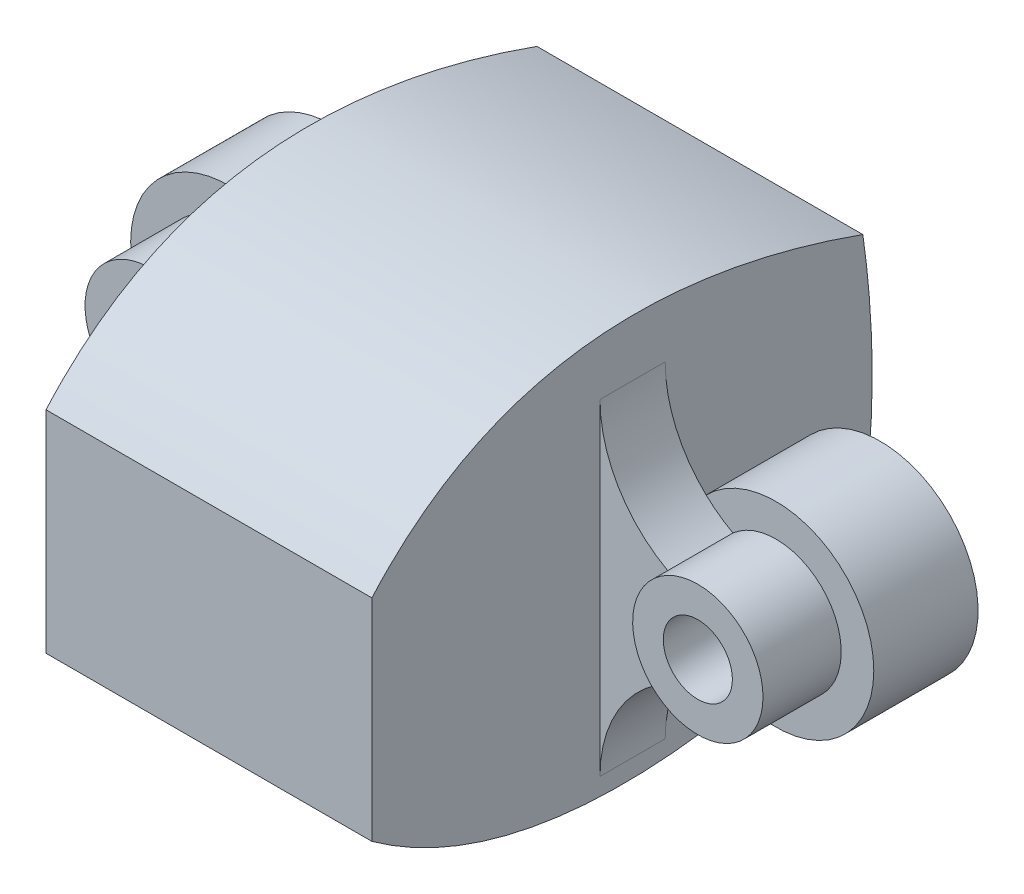
ISO-10303-21;
HEADER;
FILE_DESCRIPTION(('STEP AP214'),'2;1');
FILE_NAME('part.step','',(''),(''),'','','');
FILE_SCHEMA(('AUTOMOTIVE_DESIGN { 1 0 10303 214 1 1 1 1 }'));
ENDSEC;
DATA;
#1=APPLICATION_CONTEXT('core data for automotive mechanical design processes');
#2=APPLICATION_PROTOCOL_DEFINITION('international standard','automotive_design',2000,#1);
#3=PRODUCT_CONTEXT('',#1,'mechanical');
#4=PRODUCT('Part','Part','',(#3));
#5=PRODUCT_RELATED_PRODUCT_CATEGORY('part','',(#4));
#6=PRODUCT_DEFINITION_FORMATION('','',#4);
#7=PRODUCT_DEFINITION_CONTEXT('part definition',#1,'design');
#8=PRODUCT_DEFINITION('design','',#6,#7);
#9=PRODUCT_DEFINITION_SHAPE('','',#8);
#10=(LENGTH_UNIT() NAMED_UNIT(*) SI_UNIT(.MILLI.,.METRE.));
#11=(NAMED_UNIT(*) PLANE_ANGLE_UNIT() SI_UNIT($,.RADIAN.));
#12=(NAMED_UNIT(*) SI_UNIT($,.STERADIAN.) SOLID_ANGLE_UNIT());
#13=UNCERTAINTY_MEASURE_WITH_UNIT(LENGTH_MEASURE(1.E-05),#10,'distance_accuracy_value','');
#14=(GEOMETRIC_REPRESENTATION_CONTEXT(3) GLOBAL_UNCERTAINTY_ASSIGNED_CONTEXT((#13)) GLOBAL_UNIT_ASSIGNED_CONTEXT((#10,
#11,#12)) REPRESENTATION_CONTEXT('',''));
#15=CARTESIAN_POINT('',(0.,0.,0.));
#16=DIRECTION('',(0.,0.,1.));
#17=DIRECTION('',(1.,0.,0.));
#18=AXIS2_PLACEMENT_3D('',#15,#16,#17);
#19=CARTESIAN_POINT('',(27.5,-3.75484590396802,0.696184676668378));
#20=DIRECTION('',(0.,0.,-1.));
#21=DIRECTION('',(-1.,0.,0.));
#22=AXIS2_PLACEMENT_3D('',#19,#20,#21);
#23=PLANE('',#22);
#24=CARTESIAN_POINT('',(-21.0048094716167,-0.00484590396801488,0.696184676668378));
#25=DIRECTION('',(0.,0.,-1.));
#26=DIRECTION('',(-1.,0.,0.));
#27=AXIS2_PLACEMENT_3D('',#24,#25,#26);
#28=CIRCLE('',#27,5.);
#29=CARTESIAN_POINT('',(-17.697620332786,-3.75484590396802,0.696184676668378));
#30=VERTEX_POINT('',#29);
#31=CARTESIAN_POINT('',(-17.697620332786,3.74515409603199,0.696184676668378));
#32=VERTEX_POINT('',#31);
#33=EDGE_CURVE('E173',#30,#32,#28,.F.);
#34=ORIENTED_EDGE('',*,*,#33,.F.);
#35=CARTESIAN_POINT('',(-22.5,-12.5262283224885,0.696184676668378));
#36=DIRECTION('',(0.,0.,-1.));
#37=DIRECTION('',(-1.,0.,0.));
#38=AXIS2_PLACEMENT_3D('',#35,#36,#37);
#39=CIRCLE('',#38,10.);
#40=CARTESIAN_POINT('',(-12.5,-12.5262283224885,0.696184676668378));
#41=VERTEX_POINT('',#40);
#42=EDGE_CURVE('E50',#30,#41,#39,.T.);
#43=ORIENTED_EDGE('',*,*,#42,.T.);
#44=DIRECTION('',(0.,1.,0.));
#45=VECTOR('',#44,1.);
#46=CARTESIAN_POINT('',(-12.5,-13.9143828199088,0.696184676668378));
#47=LINE('',#46,#45);
#48=CARTESIAN_POINT('',(-12.5,12.5165365145524,0.696184676668378));
#49=VERTEX_POINT('',#48);
#50=EDGE_CURVE('E344',#41,#49,#47,.T.);
#51=ORIENTED_EDGE('',*,*,#50,.T.);
#52=CARTESIAN_POINT('',(-22.5,12.5165365145524,0.696184676668378));
#53=DIRECTION('',(0.,0.,-1.));
#54=DIRECTION('',(-1.,0.,0.));
#55=AXIS2_PLACEMENT_3D('',#52,#53,#54);
#56=CIRCLE('',#55,10.);
#57=EDGE_CURVE('E395',#49,#32,#56,.T.);
#58=ORIENTED_EDGE('',*,*,#57,.T.);
#59=EDGE_LOOP('',(#34,#43,#51,#58));
#60=FACE_BOUND('',#59,.T.);
#61=ADVANCED_FACE('F41',(#60),#23,.F.);
#62=CARTESIAN_POINT('',(21.0048094716167,-0.00484590396801488,0.696184676668378));
#63=DIRECTION('',(0.,0.,-1.));
#64=DIRECTION('',(-1.,0.,0.));
#65=AXIS2_PLACEMENT_3D('',#62,#63,#64);
#66=CIRCLE('',#65,5.);
#67=CARTESIAN_POINT('',(17.697620332786,3.74515409603199,0.696184676668378));
#68=VERTEX_POINT('',#67);
#69=CARTESIAN_POINT('',(17.697620332786,-3.75484590396802,0.696184676668378));
#70=VERTEX_POINT('',#69);
#71=EDGE_CURVE('E190',#68,#70,#66,.F.);
#72=ORIENTED_EDGE('',*,*,#71,.F.);
#73=CARTESIAN_POINT('',(22.5,12.5165365145524,0.696184676668378));
#74=DIRECTION('',(0.,0.,-1.));
#75=DIRECTION('',(-1.,0.,0.));
#76=AXIS2_PLACEMENT_3D('',#73,#74,#75);
#77=CIRCLE('',#76,10.);
#78=CARTESIAN_POINT('',(12.5,12.5165365145524,0.696184676668378));
#79=VERTEX_POINT('',#78);
#80=EDGE_CURVE('E387',#68,#79,#77,.T.);
#81=ORIENTED_EDGE('',*,*,#80,.T.);
#82=DIRECTION('',(0.,1.,0.));
#83=VECTOR('',#82,1.);
#84=CARTESIAN_POINT('',(12.5,-13.9143828199088,0.696184676668378));
#85=LINE('',#84,#83);
#86=CARTESIAN_POINT('',(12.5,-12.5262283224885,0.696184676668378));
#87=VERTEX_POINT('',#86);
#88=EDGE_CURVE('E208',#87,#79,#85,.T.);
#89=ORIENTED_EDGE('',*,*,#88,.F.);
#90=CARTESIAN_POINT('',(22.5,-12.5262283224885,0.696184676668378));
#91=DIRECTION('',(0.,0.,-1.));
#92=DIRECTION('',(-1.,0.,0.));
#93=AXIS2_PLACEMENT_3D('',#90,#91,#92);
#94=CIRCLE('',#93,10.);
#95=EDGE_CURVE('E376',#87,#70,#94,.T.);
#96=ORIENTED_EDGE('',*,*,#95,.T.);
#97=EDGE_LOOP('',(#72,#81,#89,#96));
#98=FACE_BOUND('',#97,.T.);
#99=ADVANCED_FACE('F260',(#98),#23,.F.);
#100=CARTESIAN_POINT('',(12.5,-13.9143828199088,-0.592625515878692));
#101=DIRECTION('',(1.,0.,0.));
#102=DIRECTION('',(0.,0.,-1.));
#103=AXIS2_PLACEMENT_3D('',#100,#101,#102);
#104=PLANE('',#103);
#105=CARTESIAN_POINT('',(12.5,-8.09421069616466,18.1961846766684));
#106=CARTESIAN_POINT('',(12.5,-16.4385603035779,6.64246983563475));
#107=CARTESIAN_POINT('',(12.5,-14.3857687324639,-8.25521453405886));
#108=CARTESIAN_POINT('',(12.5,-10.7478647549805,-18.0989547084256));
#109=B_SPLINE_CURVE_WITH_KNOTS('',3,(#105,#106,#107,#108),.UNSPECIFIED.,.F.,.F.,(4,4),(0.,1.),.UNSPECIFIED.);
#110=CARTESIAN_POINT('',(12.5,-8.09421069616467,18.1961846766684));
#111=VERTEX_POINT('',#110);
#112=CARTESIAN_POINT('',(12.5,-10.7478647549805,-18.0989547084256));
#113=VERTEX_POINT('',#112);
#114=EDGE_CURVE('E218',#111,#113,#109,.T.);
#115=ORIENTED_EDGE('',*,*,#114,.T.);
#116=CARTESIAN_POINT('',(12.5,-10.7478647549805,-18.0989547084256));
#117=CARTESIAN_POINT('',(12.5,-0.263434206745711,-21.4154582491938));
#118=CARTESIAN_POINT('',(12.5,13.3918270058603,-19.4685826097499));
#119=B_SPLINE_CURVE_WITH_KNOTS('',2,(#116,#117,#118),.UNSPECIFIED.,.F.,.F.,(3,3),(0.,1.),.UNSPECIFIED.);
#120=CARTESIAN_POINT('',(12.5,13.3918270058603,-19.4685826097499));
#121=VERTEX_POINT('',#120);
#122=EDGE_CURVE('E225',#113,#121,#119,.T.);
#123=ORIENTED_EDGE('',*,*,#122,.T.);
#124=CARTESIAN_POINT('',(12.5,13.3918270058603,-19.4685826097499));
#125=CARTESIAN_POINT('',(12.5,22.3791261316538,5.56746495496059));
#126=CARTESIAN_POINT('',(12.5,8.08451888822864,18.1961846766684));
#127=B_SPLINE_CURVE_WITH_KNOTS('',2,(#124,#125,#126),.UNSPECIFIED.,.F.,.F.,(3,3),(0.,1.),.UNSPECIFIED.);
#128=CARTESIAN_POINT('',(12.5,8.08451888822864,18.1961846766684));
#129=VERTEX_POINT('',#128);
#130=EDGE_CURVE('E290',#121,#129,#127,.T.);
#131=ORIENTED_EDGE('',*,*,#130,.T.);
#132=DIRECTION('',(0.,-1.,0.));
#133=VECTOR('',#132,1.);
#134=CARTESIAN_POINT('',(12.5,-8.09421069616467,18.1961846766684));
#135=LINE('',#134,#133);
#136=EDGE_CURVE('E296',#129,#111,#135,.T.);
#137=ORIENTED_EDGE('',*,*,#136,.T.);
#138=EDGE_LOOP('',(#115,#123,#131,#137));
#139=FACE_BOUND('',#138,.T.);
#140=DIRECTION('',(0.,0.,1.));
#141=VECTOR('',#140,1.);
#142=CARTESIAN_POINT('',(12.5,-12.5262283224885,0.696184676668378));
#143=LINE('',#142,#141);
#144=CARTESIAN_POINT('',(12.5,-12.5262283224885,-4.30381532333162));
#145=VERTEX_POINT('',#144);
#146=EDGE_CURVE('E356',#145,#87,#143,.T.);
#147=ORIENTED_EDGE('',*,*,#146,.T.);
#148=ORIENTED_EDGE('',*,*,#88,.T.);
#149=DIRECTION('',(0.,0.,1.));
#150=VECTOR('',#149,1.);
#151=CARTESIAN_POINT('',(12.5,12.5165365145524,-4.30381532333162));
#152=LINE('',#151,#150);
#153=CARTESIAN_POINT('',(12.5,12.5165365145524,-4.30381532333162));
#154=VERTEX_POINT('',#153);
#155=EDGE_CURVE('E352',#79,#154,#152,.F.);
#156=ORIENTED_EDGE('',*,*,#155,.T.);
#157=DIRECTION('',(0.,-1.,0.));
#158=VECTOR('',#157,1.);
#159=CARTESIAN_POINT('',(12.5,-13.9143828199088,-4.30381532333162));
#160=LINE('',#159,#158);
#161=EDGE_CURVE('E214',#154,#145,#160,.T.);
#162=ORIENTED_EDGE('',*,*,#161,.T.);
#163=EDGE_LOOP('',(#147,#148,#156,#162));
#164=FACE_BOUND('',#163,.T.);
#165=ADVANCED_FACE('F266',(#139,#164),#104,.T.);
#166=CARTESIAN_POINT('',(-12.5,-13.9143828199088,-0.592625515878692));
#167=DIRECTION('',(1.,0.,0.));
#168=DIRECTION('',(0.,0.,-1.));
#169=AXIS2_PLACEMENT_3D('',#166,#167,#168);
#170=PLANE('',#169);
#171=CARTESIAN_POINT('',(-12.5,-8.09421069616466,18.1961846766684));
#172=CARTESIAN_POINT('',(-12.5,-16.4385603035779,6.64246983563475));
#173=CARTESIAN_POINT('',(-12.5,-14.3857687324639,-8.25521453405886));
#174=CARTESIAN_POINT('',(-12.5,-10.7478647549805,-18.0989547084256));
#175=B_SPLINE_CURVE_WITH_KNOTS('',3,(#171,#172,#173,#174),.UNSPECIFIED.,.F.,.F.,(4,4),(0.,1.),.UNSPECIFIED.);
#176=CARTESIAN_POINT('',(-12.5,-8.09421069616467,18.1961846766684));
#177=VERTEX_POINT('',#176);
#178=CARTESIAN_POINT('',(-12.5,-10.7478647549805,-18.0989547084256));
#179=VERTEX_POINT('',#178);
#180=EDGE_CURVE('E217',#177,#179,#175,.T.);
#181=ORIENTED_EDGE('',*,*,#180,.F.);
#182=DIRECTION('',(0.,-1.,0.));
#183=VECTOR('',#182,1.);
#184=CARTESIAN_POINT('',(-12.5,-8.09421069616467,18.1961846766684));
#185=LINE('',#184,#183);
#186=CARTESIAN_POINT('',(-12.5,8.08451888822864,18.1961846766684));
#187=VERTEX_POINT('',#186);
#188=EDGE_CURVE('E226',#187,#177,#185,.T.);
#189=ORIENTED_EDGE('',*,*,#188,.F.);
#190=CARTESIAN_POINT('',(-12.5,13.3918270058603,-19.4685826097499));
#191=CARTESIAN_POINT('',(-12.5,22.3791261316538,5.56746495496059));
#192=CARTESIAN_POINT('',(-12.5,8.08451888822864,18.1961846766684));
#193=B_SPLINE_CURVE_WITH_KNOTS('',2,(#190,#191,#192),.UNSPECIFIED.,.F.,.F.,(3,3),(0.,1.),.UNSPECIFIED.);
#194=CARTESIAN_POINT('',(-12.5,13.3918270058603,-19.4685826097499));
#195=VERTEX_POINT('',#194);
#196=EDGE_CURVE('E316',#195,#187,#193,.T.);
#197=ORIENTED_EDGE('',*,*,#196,.F.);
#198=CARTESIAN_POINT('',(-12.5,-10.7478647549805,-18.0989547084256));
#199=CARTESIAN_POINT('',(-12.5,-0.263434206745711,-21.4154582491938));
#200=CARTESIAN_POINT('',(-12.5,13.3918270058603,-19.4685826097499));
#201=B_SPLINE_CURVE_WITH_KNOTS('',2,(#198,#199,#200),.UNSPECIFIED.,.F.,.F.,(3,3),(0.,1.),.UNSPECIFIED.);
#202=EDGE_CURVE('E308',#179,#195,#201,.T.);
#203=ORIENTED_EDGE('',*,*,#202,.F.);
#204=EDGE_LOOP('',(#181,#189,#197,#203));
#205=FACE_BOUND('',#204,.T.);
#206=DIRECTION('',(0.,-1.,0.));
#207=VECTOR('',#206,1.);
#208=CARTESIAN_POINT('',(-12.5,-13.9143828199088,-4.30381532333162));
#209=LINE('',#208,#207);
#210=CARTESIAN_POINT('',(-12.5,12.5165365145524,-4.30381532333162));
#211=VERTEX_POINT('',#210);
#212=CARTESIAN_POINT('',(-12.5,-12.5262283224885,-4.30381532333162));
#213=VERTEX_POINT('',#212);
#214=EDGE_CURVE('E347',#211,#213,#209,.T.);
#215=ORIENTED_EDGE('',*,*,#214,.F.);
#216=DIRECTION('',(0.,0.,-1.));
#217=VECTOR('',#216,1.);
#218=CARTESIAN_POINT('',(-12.5,12.5165365145524,-0.592625515878692));
#219=LINE('',#218,#217);
#220=EDGE_CURVE('E155',#211,#49,#219,.F.);
#221=ORIENTED_EDGE('',*,*,#220,.T.);
#222=ORIENTED_EDGE('',*,*,#50,.F.);
#223=DIRECTION('',(0.,0.,-1.));
#224=VECTOR('',#223,1.);
#225=CARTESIAN_POINT('',(-12.5,-12.5262283224885,-0.592625515878692));
#226=LINE('',#225,#224);
#227=EDGE_CURVE('E367',#41,#213,#226,.T.);
#228=ORIENTED_EDGE('',*,*,#227,.T.);
#229=EDGE_LOOP('',(#215,#221,#222,#228));
#230=FACE_BOUND('',#229,.T.);
#231=ADVANCED_FACE('F240',(#205,#230),#170,.F.);
#232=DIRECTION('',(-1.,0.,0.));
#233=VECTOR('',#232,1.);
#234=SURFACE_OF_LINEAR_EXTRUSION('',#109,#233);
#235=ORIENTED_EDGE('',*,*,#180,.T.);
#236=DIRECTION('',(-1.,0.,0.));
#237=VECTOR('',#236,1.);
#238=CARTESIAN_POINT('',(12.5,-10.7478647549805,-18.0989547084256));
#239=LINE('',#238,#237);
#240=EDGE_CURVE('E340',#113,#179,#239,.T.);
#241=ORIENTED_EDGE('',*,*,#240,.F.);
#242=ORIENTED_EDGE('',*,*,#114,.F.);
#243=DIRECTION('',(-1.,0.,0.));
#244=VECTOR('',#243,1.);
#245=CARTESIAN_POINT('',(12.5,-8.09421069616467,18.1961846766684));
#246=LINE('',#245,#244);
#247=EDGE_CURVE('E302',#111,#177,#246,.T.);
#248=ORIENTED_EDGE('',*,*,#247,.T.);
#249=EDGE_LOOP('',(#235,#241,#242,#248));
#250=FACE_BOUND('',#249,.T.);
#251=ADVANCED_FACE('F235',(#250),#234,.F.);
#252=DIRECTION('',(-1.,0.,0.));
#253=VECTOR('',#252,1.);
#254=SURFACE_OF_LINEAR_EXTRUSION('',#119,#253);
#255=ORIENTED_EDGE('',*,*,#202,.T.);
#256=DIRECTION('',(-1.,0.,0.));
#257=VECTOR('',#256,1.);
#258=CARTESIAN_POINT('',(12.5,13.3918270058603,-19.4685826097499));
#259=LINE('',#258,#257);
#260=EDGE_CURVE('E336',#121,#195,#259,.T.);
#261=ORIENTED_EDGE('',*,*,#260,.F.);
#262=ORIENTED_EDGE('',*,*,#122,.F.);
#263=ORIENTED_EDGE('',*,*,#240,.T.);
#264=EDGE_LOOP('',(#255,#261,#262,#263));
#265=FACE_BOUND('',#264,.T.);
#266=ADVANCED_FACE('F239',(#265),#254,.F.);
#267=DIRECTION('',(-1.,0.,0.));
#268=VECTOR('',#267,1.);
#269=SURFACE_OF_LINEAR_EXTRUSION('',#127,#268);
#270=ORIENTED_EDGE('',*,*,#196,.T.);
#271=DIRECTION('',(-1.,0.,0.));
#272=VECTOR('',#271,1.);
#273=CARTESIAN_POINT('',(12.5,8.08451888822864,18.1961846766684));
#274=LINE('',#273,#272);
#275=EDGE_CURVE('E332',#129,#187,#274,.T.);
#276=ORIENTED_EDGE('',*,*,#275,.F.);
#277=ORIENTED_EDGE('',*,*,#130,.F.);
#278=ORIENTED_EDGE('',*,*,#260,.T.);
#279=EDGE_LOOP('',(#270,#276,#277,#278));
#280=FACE_BOUND('',#279,.T.);
#281=ADVANCED_FACE('F286',(#280),#269,.F.);
#282=CARTESIAN_POINT('',(12.5,-8.09421069616467,18.1961846766684));
#283=DIRECTION('',(0.,0.,-1.));
#284=DIRECTION('',(-1.,0.,0.));
#285=AXIS2_PLACEMENT_3D('',#282,#283,#284);
#286=PLANE('',#285);
#287=ORIENTED_EDGE('',*,*,#188,.T.);
#288=ORIENTED_EDGE('',*,*,#247,.F.);
#289=ORIENTED_EDGE('',*,*,#136,.F.);
#290=ORIENTED_EDGE('',*,*,#275,.T.);
#291=EDGE_LOOP('',(#287,#288,#289,#290));
#292=FACE_BOUND('',#291,.T.);
#293=ADVANCED_FACE('F284',(#292),#286,.F.);
#294=CARTESIAN_POINT('',(27.5,-3.75484590396802,-4.30381532333162));
#295=DIRECTION('',(0.,0.,1.));
#296=DIRECTION('',(1.,0.,0.));
#297=AXIS2_PLACEMENT_3D('',#294,#295,#296);
#298=PLANE('',#297);
#299=CARTESIAN_POINT('',(-21.0048094716167,-0.00484590396801488,-4.30381532333162));
#300=DIRECTION('',(0.,0.,1.));
#301=DIRECTION('',(1.,0.,0.));
#302=AXIS2_PLACEMENT_3D('',#299,#300,#301);
#303=CIRCLE('',#302,7.5);
#304=CARTESIAN_POINT('',(-15.6421857546785,5.2384609600761,-4.30381532333162));
#305=VERTEX_POINT('',#304);
#306=CARTESIAN_POINT('',(-15.6421857546785,-5.24815276801212,-4.30381532333162));
#307=VERTEX_POINT('',#306);
#308=EDGE_CURVE('E56',#305,#307,#303,.F.);
#309=ORIENTED_EDGE('',*,*,#308,.F.);
#310=CARTESIAN_POINT('',(-22.5,12.5165365145524,-4.30381532333162));
#311=DIRECTION('',(0.,0.,1.));
#312=DIRECTION('',(1.,0.,0.));
#313=AXIS2_PLACEMENT_3D('',#310,#311,#312);
#314=CIRCLE('',#313,10.);
#315=EDGE_CURVE('E391',#305,#211,#314,.T.);
#316=ORIENTED_EDGE('',*,*,#315,.T.);
#317=ORIENTED_EDGE('',*,*,#214,.T.);
#318=CARTESIAN_POINT('',(-22.5,-12.5262283224885,-4.30381532333162));
#319=DIRECTION('',(0.,0.,1.));
#320=DIRECTION('',(1.,0.,0.));
#321=AXIS2_PLACEMENT_3D('',#318,#319,#320);
#322=CIRCLE('',#321,10.);
#323=EDGE_CURVE('E11',#213,#307,#322,.T.);
#324=ORIENTED_EDGE('',*,*,#323,.T.);
#325=EDGE_LOOP('',(#309,#316,#317,#324));
#326=FACE_BOUND('',#325,.T.);
#327=ADVANCED_FACE('F276',(#326),#298,.F.);
#328=CARTESIAN_POINT('',(21.0048094716167,-0.00484590396801488,-4.30381532333162));
#329=DIRECTION('',(0.,0.,-1.));
#330=DIRECTION('',(-1.,0.,0.));
#331=AXIS2_PLACEMENT_3D('',#328,#329,#330);
#332=CIRCLE('',#331,7.5);
#333=CARTESIAN_POINT('',(15.6421857546785,-5.24815276801213,-4.30381532333162));
#334=VERTEX_POINT('',#333);
#335=CARTESIAN_POINT('',(15.6421857546785,5.2384609600761,-4.30381532333162));
#336=VERTEX_POINT('',#335);
#337=EDGE_CURVE('E64',#334,#336,#332,.T.);
#338=ORIENTED_EDGE('',*,*,#337,.F.);
#339=CARTESIAN_POINT('',(22.5,-12.5262283224885,-4.30381532333162));
#340=DIRECTION('',(0.,0.,1.));
#341=DIRECTION('',(1.,0.,0.));
#342=AXIS2_PLACEMENT_3D('',#339,#340,#341);
#343=CIRCLE('',#342,10.);
#344=EDGE_CURVE('E379',#334,#145,#343,.T.);
#345=ORIENTED_EDGE('',*,*,#344,.T.);
#346=ORIENTED_EDGE('',*,*,#161,.F.);
#347=CARTESIAN_POINT('',(22.5,12.5165365145524,-4.30381532333162));
#348=DIRECTION('',(0.,0.,1.));
#349=DIRECTION('',(1.,0.,0.));
#350=AXIS2_PLACEMENT_3D('',#347,#348,#349);
#351=CIRCLE('',#350,10.);
#352=EDGE_CURVE('E383',#154,#336,#351,.T.);
#353=ORIENTED_EDGE('',*,*,#352,.T.);
#354=EDGE_LOOP('',(#338,#345,#346,#353));
#355=FACE_BOUND('',#354,.T.);
#356=ADVANCED_FACE('F272',(#355),#298,.F.);
#357=CARTESIAN_POINT('',(21.0048094716167,-0.00484590396801488,-4.30381532333162));
#358=DIRECTION('',(0.,0.,-1.));
#359=DIRECTION('',(-1.,0.,0.));
#360=AXIS2_PLACEMENT_3D('',#357,#358,#359);
#361=PLANE('',#360);
#362=CARTESIAN_POINT('',(21.0048094716167,-0.00484590396801488,-4.30381532333162));
#363=DIRECTION('',(0.,0.,1.));
#364=DIRECTION('',(1.,0.,0.));
#365=AXIS2_PLACEMENT_3D('',#362,#363,#364);
#366=CIRCLE('',#365,5.);
#367=CARTESIAN_POINT('',(17.697620332786,-3.75484590396802,-4.30381532333162));
#368=VERTEX_POINT('',#367);
#369=CARTESIAN_POINT('',(17.697620332786,3.74515409603199,-4.30381532333162));
#370=VERTEX_POINT('',#369);
#371=EDGE_CURVE('E172',#368,#370,#366,.T.);
#372=ORIENTED_EDGE('',*,*,#371,.F.);
#373=CARTESIAN_POINT('',(22.5,-12.5262283224885,-4.30381532333162));
#374=DIRECTION('',(0.,0.,-1.));
#375=DIRECTION('',(-1.,0.,0.));
#376=AXIS2_PLACEMENT_3D('',#373,#374,#375);
#377=CIRCLE('',#376,10.);
#378=EDGE_CURVE('E363',#368,#334,#377,.F.);
#379=ORIENTED_EDGE('',*,*,#378,.T.);
#380=EDGE_CURVE('E209',#336,#334,#332,.T.);
#381=ORIENTED_EDGE('',*,*,#380,.F.);
#382=CARTESIAN_POINT('',(22.5,12.5165365145524,-4.30381532333162));
#383=DIRECTION('',(0.,0.,-1.));
#384=DIRECTION('',(-1.,0.,0.));
#385=AXIS2_PLACEMENT_3D('',#382,#383,#384);
#386=CIRCLE('',#385,10.);
#387=EDGE_CURVE('E360',#336,#370,#386,.F.);
#388=ORIENTED_EDGE('',*,*,#387,.T.);
#389=EDGE_LOOP('',(#372,#379,#381,#388));
#390=FACE_BOUND('',#389,.T.);
#391=ADVANCED_FACE('F275',(#390),#361,.F.);
#392=CARTESIAN_POINT('',(21.0048094716167,-0.00484590396801488,-12.3038153233316));
#393=DIRECTION('',(0.,0.,1.));
#394=DIRECTION('',(1.,0.,0.));
#395=AXIS2_PLACEMENT_3D('',#392,#393,#394);
#396=CYLINDRICAL_SURFACE('',#395,7.5);
#397=CARTESIAN_POINT('',(21.0048094716167,-0.00484590396801488,-12.3038153233316));
#398=DIRECTION('',(0.,0.,-1.));
#399=DIRECTION('',(-1.,0.,0.));
#400=AXIS2_PLACEMENT_3D('',#397,#398,#399);
#401=CIRCLE('',#400,7.5);
#402=CARTESIAN_POINT('',(13.5048094716167,-0.00484590396801488,-12.3038153233316));
#403=VERTEX_POINT('',#402);
#404=EDGE_CURVE('E204',#403,#403,#401,.T.);
#405=ORIENTED_EDGE('',*,*,#404,.F.);
#406=EDGE_LOOP('',(#405));
#407=FACE_BOUND('',#406,.T.);
#408=ORIENTED_EDGE('',*,*,#337,.T.);
#409=ORIENTED_EDGE('',*,*,#380,.T.);
#410=EDGE_LOOP('',(#408,#409));
#411=FACE_BOUND('',#410,.T.);
#412=ADVANCED_FACE('F270',(#407,#411),#396,.T.);
#413=CARTESIAN_POINT('',(21.0048094716167,-0.00484590396801488,-12.3038153233316));
#414=DIRECTION('',(0.,0.,-1.));
#415=DIRECTION('',(-1.,0.,0.));
#416=AXIS2_PLACEMENT_3D('',#413,#414,#415);
#417=PLANE('',#416);
#418=ORIENTED_EDGE('',*,*,#404,.T.);
#419=EDGE_LOOP('',(#418));
#420=FACE_BOUND('',#419,.T.);
#421=ADVANCED_FACE('F454',(#420),#417,.T.);
#422=CARTESIAN_POINT('',(-21.0048094716167,-0.00484590396801488,-4.30381532333162));
#423=DIRECTION('',(0.,0.,-1.));
#424=DIRECTION('',(-1.,0.,0.));
#425=AXIS2_PLACEMENT_3D('',#422,#423,#424);
#426=PLANE('',#425);
#427=CARTESIAN_POINT('',(-21.0048094716167,-0.00484590396801488,-4.30381532333162));
#428=DIRECTION('',(0.,0.,1.));
#429=DIRECTION('',(1.,0.,0.));
#430=AXIS2_PLACEMENT_3D('',#427,#428,#429);
#431=CIRCLE('',#430,5.);
#432=CARTESIAN_POINT('',(-17.697620332786,3.74515409603199,-4.30381532333162));
#433=VERTEX_POINT('',#432);
#434=CARTESIAN_POINT('',(-17.697620332786,-3.75484590396802,-4.30381532333162));
#435=VERTEX_POINT('',#434);
#436=EDGE_CURVE('E147',#433,#435,#431,.T.);
#437=ORIENTED_EDGE('',*,*,#436,.F.);
#438=CARTESIAN_POINT('',(-22.5,12.5165365145524,-4.30381532333162));
#439=DIRECTION('',(0.,0.,-1.));
#440=DIRECTION('',(-1.,0.,0.));
#441=AXIS2_PLACEMENT_3D('',#438,#439,#440);
#442=CIRCLE('',#441,10.);
#443=EDGE_CURVE('E154',#433,#305,#442,.F.);
#444=ORIENTED_EDGE('',*,*,#443,.T.);
#445=CARTESIAN_POINT('',(-21.0048094716167,-0.00484590396801488,-4.30381532333162));
#446=DIRECTION('',(0.,0.,-1.));
#447=DIRECTION('',(-1.,0.,0.));
#448=AXIS2_PLACEMENT_3D('',#445,#446,#447);
#449=CIRCLE('',#448,7.5);
#450=EDGE_CURVE('E149',#307,#305,#449,.T.);
#451=ORIENTED_EDGE('',*,*,#450,.F.);
#452=CARTESIAN_POINT('',(-22.5,-12.5262283224885,-4.30381532333162));
#453=DIRECTION('',(0.,0.,-1.));
#454=DIRECTION('',(-1.,0.,0.));
#455=AXIS2_PLACEMENT_3D('',#452,#453,#454);
#456=CIRCLE('',#455,10.);
#457=EDGE_CURVE('E143',#307,#435,#456,.F.);
#458=ORIENTED_EDGE('',*,*,#457,.T.);
#459=EDGE_LOOP('',(#437,#444,#451,#458));
#460=FACE_BOUND('',#459,.T.);
#461=ADVANCED_FACE('F145',(#460),#426,.F.);
#462=CARTESIAN_POINT('',(-21.0048094716167,-0.00484590396801488,-12.3038153233316));
#463=DIRECTION('',(0.,0.,1.));
#464=DIRECTION('',(1.,0.,0.));
#465=AXIS2_PLACEMENT_3D('',#462,#463,#464);
#466=CYLINDRICAL_SURFACE('',#465,7.5);
#467=CARTESIAN_POINT('',(-21.0048094716167,-0.00484590396801488,-12.3038153233316));
#468=DIRECTION('',(0.,0.,-1.));
#469=DIRECTION('',(-1.,0.,0.));
#470=AXIS2_PLACEMENT_3D('',#467,#468,#469);
#471=CIRCLE('',#470,7.5);
#472=CARTESIAN_POINT('',(-28.5048094716167,-0.00484590396801488,-12.3038153233316));
#473=VERTEX_POINT('',#472);
#474=EDGE_CURVE('E198',#473,#473,#471,.T.);
#475=ORIENTED_EDGE('',*,*,#474,.F.);
#476=EDGE_LOOP('',(#475));
#477=FACE_BOUND('',#476,.T.);
#478=ORIENTED_EDGE('',*,*,#308,.T.);
#479=ORIENTED_EDGE('',*,*,#450,.T.);
#480=EDGE_LOOP('',(#478,#479));
#481=FACE_BOUND('',#480,.T.);
#482=ADVANCED_FACE('F466',(#477,#481),#466,.T.);
#483=CARTESIAN_POINT('',(-21.0048094716167,-0.00484590396801488,-12.3038153233316));
#484=DIRECTION('',(0.,0.,-1.));
#485=DIRECTION('',(-1.,0.,0.));
#486=AXIS2_PLACEMENT_3D('',#483,#484,#485);
#487=PLANE('',#486);
#488=ORIENTED_EDGE('',*,*,#474,.T.);
#489=EDGE_LOOP('',(#488));
#490=FACE_BOUND('',#489,.T.);
#491=ADVANCED_FACE('F440',(#490),#487,.T.);
#492=CARTESIAN_POINT('',(21.0048094716167,-0.00484590396801488,1.69618467666838));
#493=DIRECTION('',(0.,0.,-1.));
#494=DIRECTION('',(-1.,0.,0.));
#495=AXIS2_PLACEMENT_3D('',#492,#493,#494);
#496=CYLINDRICAL_SURFACE('',#495,5.);
#497=CARTESIAN_POINT('',(21.0048094716167,-0.00484590396801488,1.69618467666838));
#498=DIRECTION('',(0.,0.,1.));
#499=DIRECTION('',(1.,0.,0.));
#500=AXIS2_PLACEMENT_3D('',#497,#498,#499);
#501=CIRCLE('',#500,5.);
#502=CARTESIAN_POINT('',(26.0048094716167,-0.00484590396801488,1.69618467666838));
#503=VERTEX_POINT('',#502);
#504=EDGE_CURVE('E178',#503,#503,#501,.T.);
#505=ORIENTED_EDGE('',*,*,#504,.F.);
#506=EDGE_LOOP('',(#505));
#507=FACE_BOUND('',#506,.T.);
#508=ORIENTED_EDGE('',*,*,#371,.T.);
#509=DIRECTION('',(0.,0.,-1.));
#510=VECTOR('',#509,1.);
#511=CARTESIAN_POINT('',(17.697620332786,3.74515409603199,1.69618467666838));
#512=LINE('',#511,#510);
#513=EDGE_CURVE('E194',#370,#68,#512,.F.);
#514=ORIENTED_EDGE('',*,*,#513,.T.);
#515=ORIENTED_EDGE('',*,*,#71,.T.);
#516=DIRECTION('',(0.,0.,-1.));
#517=VECTOR('',#516,1.);
#518=CARTESIAN_POINT('',(17.697620332786,-3.75484590396802,1.69618467666838));
#519=LINE('',#518,#517);
#520=EDGE_CURVE('E185',#70,#368,#519,.T.);
#521=ORIENTED_EDGE('',*,*,#520,.T.);
#522=EDGE_LOOP('',(#508,#514,#515,#521));
#523=FACE_BOUND('',#522,.T.);
#524=ADVANCED_FACE('F434',(#507,#523),#496,.T.);
#525=CARTESIAN_POINT('',(21.0048094716167,-0.00484590396801488,1.69618467666838));
#526=DIRECTION('',(0.,0.,1.));
#527=DIRECTION('',(1.,0.,0.));
#528=AXIS2_PLACEMENT_3D('',#525,#526,#527);
#529=PLANE('',#528);
#530=CARTESIAN_POINT('',(21.0048094716167,-0.00484590396801488,1.69618467666838));
#531=DIRECTION('',(0.,0.,1.));
#532=DIRECTION('',(1.,0.,0.));
#533=AXIS2_PLACEMENT_3D('',#530,#531,#532);
#534=CIRCLE('',#533,2.65);
#535=CARTESIAN_POINT('',(23.6548094716167,-0.00484590396801488,1.69618467666838));
#536=VERTEX_POINT('',#535);
#537=EDGE_CURVE('E414',#536,#536,#534,.T.);
#538=ORIENTED_EDGE('',*,*,#537,.F.);
#539=EDGE_LOOP('',(#538));
#540=FACE_BOUND('',#539,.T.);
#541=ORIENTED_EDGE('',*,*,#504,.T.);
#542=EDGE_LOOP('',(#541));
#543=FACE_BOUND('',#542,.T.);
#544=ADVANCED_FACE('F431',(#540,#543),#529,.T.);
#545=CARTESIAN_POINT('',(-21.0048094716167,-0.00484590396801488,1.69618467666838));
#546=DIRECTION('',(0.,0.,-1.));
#547=DIRECTION('',(-1.,0.,0.));
#548=AXIS2_PLACEMENT_3D('',#545,#546,#547);
#549=CYLINDRICAL_SURFACE('',#548,5.);
#550=CARTESIAN_POINT('',(-21.0048094716167,-0.00484590396801488,1.69618467666838));
#551=DIRECTION('',(0.,0.,1.));
#552=DIRECTION('',(1.,0.,0.));
#553=AXIS2_PLACEMENT_3D('',#550,#551,#552);
#554=CIRCLE('',#553,5.);
#555=CARTESIAN_POINT('',(-16.0048094716167,-0.00484590396801488,1.69618467666838));
#556=VERTEX_POINT('',#555);
#557=EDGE_CURVE('E165',#556,#556,#554,.T.);
#558=ORIENTED_EDGE('',*,*,#557,.F.);
#559=EDGE_LOOP('',(#558));
#560=FACE_BOUND('',#559,.T.);
#561=ORIENTED_EDGE('',*,*,#436,.T.);
#562=DIRECTION('',(0.,0.,-1.));
#563=VECTOR('',#562,1.);
#564=CARTESIAN_POINT('',(-17.697620332786,-3.75484590396802,1.69618467666838));
#565=LINE('',#564,#563);
#566=EDGE_CURVE('E161',#435,#30,#565,.F.);
#567=ORIENTED_EDGE('',*,*,#566,.T.);
#568=ORIENTED_EDGE('',*,*,#33,.T.);
#569=DIRECTION('',(0.,0.,-1.));
#570=VECTOR('',#569,1.);
#571=CARTESIAN_POINT('',(-17.697620332786,3.74515409603199,1.69618467666838));
#572=LINE('',#571,#570);
#573=EDGE_CURVE('E163',#32,#433,#572,.T.);
#574=ORIENTED_EDGE('',*,*,#573,.T.);
#575=EDGE_LOOP('',(#561,#567,#568,#574));
#576=FACE_BOUND('',#575,.T.);
#577=ADVANCED_FACE('F159',(#560,#576),#549,.T.);
#578=CARTESIAN_POINT('',(-21.0048094716167,-0.00484590396801488,1.69618467666838));
#579=DIRECTION('',(0.,0.,1.));
#580=DIRECTION('',(1.,0.,0.));
#581=AXIS2_PLACEMENT_3D('',#578,#579,#580);
#582=PLANE('',#581);
#583=CARTESIAN_POINT('',(-21.0048094716167,-0.00484590396801488,1.69618467666838));
#584=DIRECTION('',(0.,0.,1.));
#585=DIRECTION('',(1.,0.,0.));
#586=AXIS2_PLACEMENT_3D('',#583,#584,#585);
#587=CIRCLE('',#586,2.65);
#588=CARTESIAN_POINT('',(-18.3548094716167,-0.00484590396801488,1.69618467666838));
#589=VERTEX_POINT('',#588);
#590=EDGE_CURVE('E406',#589,#589,#587,.T.);
#591=ORIENTED_EDGE('',*,*,#590,.F.);
#592=EDGE_LOOP('',(#591));
#593=FACE_BOUND('',#592,.T.);
#594=ORIENTED_EDGE('',*,*,#557,.T.);
#595=EDGE_LOOP('',(#594));
#596=FACE_BOUND('',#595,.T.);
#597=ADVANCED_FACE('F247',(#593,#596),#582,.T.);
#598=CARTESIAN_POINT('',(22.5,-12.5262283224885,1.69618467666838));
#599=DIRECTION('',(0.,0.,-1.));
#600=DIRECTION('',(-1.,0.,0.));
#601=AXIS2_PLACEMENT_3D('',#598,#599,#600);
#602=CYLINDRICAL_SURFACE('',#601,10.);
#603=ORIENTED_EDGE('',*,*,#378,.F.);
#604=ORIENTED_EDGE('',*,*,#520,.F.);
#605=ORIENTED_EDGE('',*,*,#95,.F.);
#606=ORIENTED_EDGE('',*,*,#146,.F.);
#607=ORIENTED_EDGE('',*,*,#344,.F.);
#608=EDGE_LOOP('',(#603,#604,#605,#606,#607));
#609=FACE_BOUND('',#608,.T.);
#610=ADVANCED_FACE('F243',(#609),#602,.F.);
#611=CARTESIAN_POINT('',(22.5,12.5165365145524,1.69618467666838));
#612=DIRECTION('',(0.,0.,-1.));
#613=DIRECTION('',(-1.,0.,0.));
#614=AXIS2_PLACEMENT_3D('',#611,#612,#613);
#615=CYLINDRICAL_SURFACE('',#614,10.);
#616=ORIENTED_EDGE('',*,*,#80,.F.);
#617=ORIENTED_EDGE('',*,*,#513,.F.);
#618=ORIENTED_EDGE('',*,*,#387,.F.);
#619=ORIENTED_EDGE('',*,*,#352,.F.);
#620=ORIENTED_EDGE('',*,*,#155,.F.);
#621=EDGE_LOOP('',(#616,#617,#618,#619,#620));
#622=FACE_BOUND('',#621,.T.);
#623=ADVANCED_FACE('F246',(#622),#615,.F.);
#624=CARTESIAN_POINT('',(-22.5,12.5165365145524,1.69618467666838));
#625=DIRECTION('',(0.,0.,-1.));
#626=DIRECTION('',(-1.,0.,0.));
#627=AXIS2_PLACEMENT_3D('',#624,#625,#626);
#628=CYLINDRICAL_SURFACE('',#627,10.);
#629=ORIENTED_EDGE('',*,*,#57,.F.);
#630=ORIENTED_EDGE('',*,*,#220,.F.);
#631=ORIENTED_EDGE('',*,*,#315,.F.);
#632=ORIENTED_EDGE('',*,*,#443,.F.);
#633=ORIENTED_EDGE('',*,*,#573,.F.);
#634=EDGE_LOOP('',(#629,#630,#631,#632,#633));
#635=FACE_BOUND('',#634,.T.);
#636=ADVANCED_FACE('F250',(#635),#628,.F.);
#637=CARTESIAN_POINT('',(-22.5,-12.5262283224885,1.69618467666838));
#638=DIRECTION('',(0.,0.,-1.));
#639=DIRECTION('',(-1.,0.,0.));
#640=AXIS2_PLACEMENT_3D('',#637,#638,#639);
#641=CYLINDRICAL_SURFACE('',#640,10.);
#642=ORIENTED_EDGE('',*,*,#323,.F.);
#643=ORIENTED_EDGE('',*,*,#227,.F.);
#644=ORIENTED_EDGE('',*,*,#42,.F.);
#645=ORIENTED_EDGE('',*,*,#566,.F.);
#646=ORIENTED_EDGE('',*,*,#457,.F.);
#647=EDGE_LOOP('',(#642,#643,#644,#645,#646));
#648=FACE_BOUND('',#647,.T.);
#649=ADVANCED_FACE('F43',(#648),#641,.F.);
#650=CARTESIAN_POINT('',(-21.0048094716167,-0.00484590396801488,-4.30381532333162));
#651=DIRECTION('',(0.,0.,1.));
#652=DIRECTION('',(1.,0.,0.));
#653=AXIS2_PLACEMENT_3D('',#650,#651,#652);
#654=CYLINDRICAL_SURFACE('',#653,2.65);
#655=CARTESIAN_POINT('',(-21.0048094716167,-0.00484590396801488,-4.30381532333162));
#656=DIRECTION('',(0.,0.,1.));
#657=DIRECTION('',(1.,0.,0.));
#658=AXIS2_PLACEMENT_3D('',#655,#656,#657);
#659=CIRCLE('',#658,2.65);
#660=CARTESIAN_POINT('',(-18.3548094716167,-0.00484590396801488,-4.30381532333162));
#661=VERTEX_POINT('',#660);
#662=EDGE_CURVE('E410',#661,#661,#659,.T.);
#663=ORIENTED_EDGE('',*,*,#662,.F.);
#664=EDGE_LOOP('',(#663));
#665=FACE_BOUND('',#664,.T.);
#666=ORIENTED_EDGE('',*,*,#590,.T.);
#667=EDGE_LOOP('',(#666));
#668=FACE_BOUND('',#667,.T.);
#669=ADVANCED_FACE('F257',(#665,#668),#654,.F.);
#670=CARTESIAN_POINT('',(-21.0048094716167,-0.00484590396801488,-4.30381532333162));
#671=DIRECTION('',(0.,0.,1.));
#672=DIRECTION('',(1.,0.,0.));
#673=AXIS2_PLACEMENT_3D('',#670,#671,#672);
#674=PLANE('',#673);
#675=ORIENTED_EDGE('',*,*,#662,.T.);
#676=EDGE_LOOP('',(#675));
#677=FACE_BOUND('',#676,.T.);
#678=ADVANCED_FACE('F427',(#677),#674,.T.);
#679=CARTESIAN_POINT('',(21.0048094716167,-0.00484590396801488,-4.30381532333162));
#680=DIRECTION('',(0.,0.,1.));
#681=DIRECTION('',(1.,0.,0.));
#682=AXIS2_PLACEMENT_3D('',#679,#680,#681);
#683=CYLINDRICAL_SURFACE('',#682,2.65);
#684=CARTESIAN_POINT('',(21.0048094716167,-0.00484590396801488,-4.30381532333162));
#685=DIRECTION('',(0.,0.,1.));
#686=DIRECTION('',(1.,0.,0.));
#687=AXIS2_PLACEMENT_3D('',#684,#685,#686);
#688=CIRCLE('',#687,2.65);
#689=CARTESIAN_POINT('',(23.6548094716167,-0.00484590396801488,-4.30381532333162));
#690=VERTEX_POINT('',#689);
#691=EDGE_CURVE('E166',#690,#690,#688,.T.);
#692=ORIENTED_EDGE('',*,*,#691,.F.);
#693=EDGE_LOOP('',(#692));
#694=FACE_BOUND('',#693,.T.);
#695=ORIENTED_EDGE('',*,*,#537,.T.);
#696=EDGE_LOOP('',(#695));
#697=FACE_BOUND('',#696,.T.);
#698=ADVANCED_FACE('F424',(#694,#697),#683,.F.);
#699=CARTESIAN_POINT('',(21.0048094716167,-0.00484590396801488,-4.30381532333162));
#700=DIRECTION('',(0.,0.,1.));
#701=DIRECTION('',(1.,0.,0.));
#702=AXIS2_PLACEMENT_3D('',#699,#700,#701);
#703=PLANE('',#702);
#704=ORIENTED_EDGE('',*,*,#691,.T.);
#705=EDGE_LOOP('',(#704));
#706=FACE_BOUND('',#705,.T.);
#707=ADVANCED_FACE('F422',(#706),#703,.T.);
#708=CLOSED_SHELL('',(#61,#99,#165,#231,#251,#266,#281,#293,#327,#356,#391,#412,#421,#461,#482,
#491,#524,#544,#577,#597,#610,#623,#636,#649,#669,#678,#698,#707));
#709=MANIFOLD_SOLID_BREP('B2',#708);
#710=ADVANCED_BREP_SHAPE_REPRESENTATION('',(#18,#709),#14);
#711=SHAPE_DEFINITION_REPRESENTATION(#9,#710);
ENDSEC;
END-ISO-10303-21;
